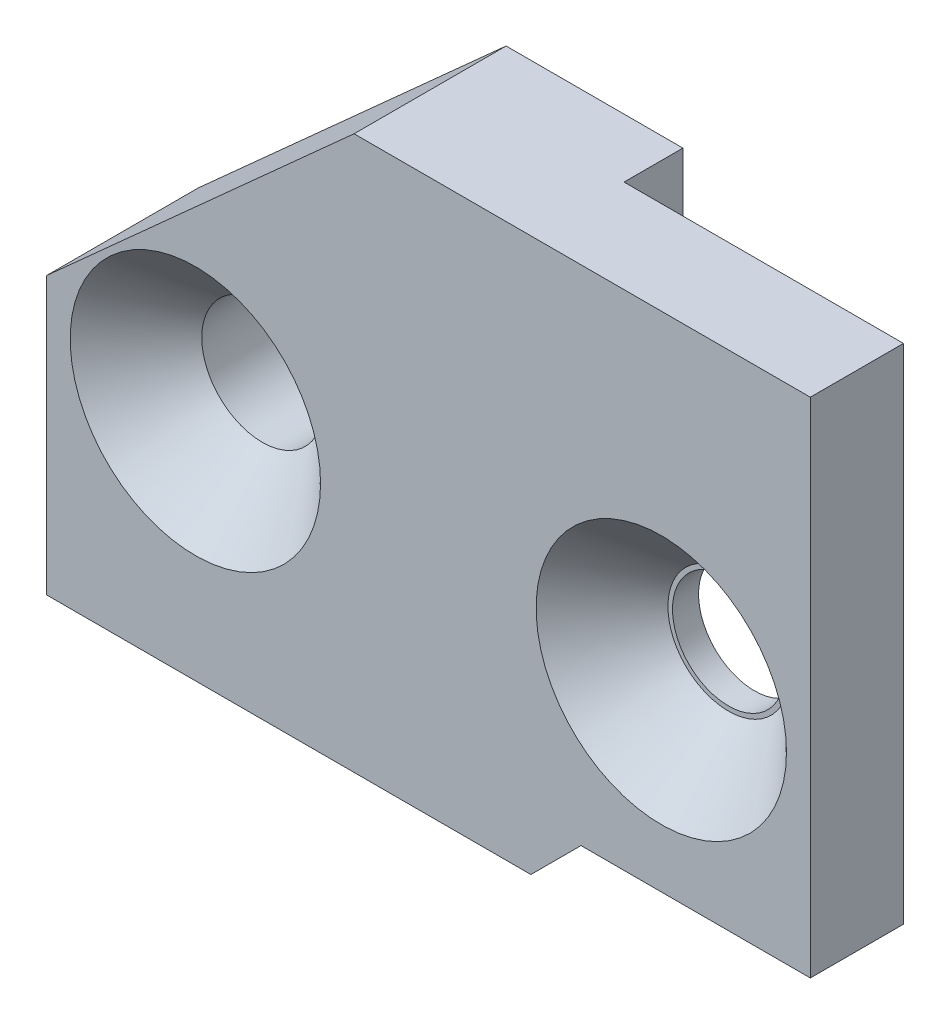
ISO-10303-21;
HEADER;
FILE_DESCRIPTION(('STEP AP214'),'2;1');
FILE_NAME('part.step','',(''),(''),'','','');
FILE_SCHEMA(('AUTOMOTIVE_DESIGN { 1 0 10303 214 1 1 1 1 }'));
ENDSEC;
DATA;
#1=APPLICATION_CONTEXT('core data for automotive mechanical design processes');
#2=APPLICATION_PROTOCOL_DEFINITION('international standard','automotive_design',2000,#1);
#3=PRODUCT_CONTEXT('',#1,'mechanical');
#4=PRODUCT('Part','Part','',(#3));
#5=PRODUCT_RELATED_PRODUCT_CATEGORY('part','',(#4));
#6=PRODUCT_DEFINITION_FORMATION('','',#4);
#7=PRODUCT_DEFINITION_CONTEXT('part definition',#1,'design');
#8=PRODUCT_DEFINITION('design','',#6,#7);
#9=PRODUCT_DEFINITION_SHAPE('','',#8);
#10=(LENGTH_UNIT() NAMED_UNIT(*) SI_UNIT(.MILLI.,.METRE.));
#11=(NAMED_UNIT(*) PLANE_ANGLE_UNIT() SI_UNIT($,.RADIAN.));
#12=(NAMED_UNIT(*) SI_UNIT($,.STERADIAN.) SOLID_ANGLE_UNIT());
#13=UNCERTAINTY_MEASURE_WITH_UNIT(LENGTH_MEASURE(1.E-05),#10,'distance_accuracy_value','');
#14=(GEOMETRIC_REPRESENTATION_CONTEXT(3) GLOBAL_UNCERTAINTY_ASSIGNED_CONTEXT((#13)) GLOBAL_UNIT_ASSIGNED_CONTEXT((#10,
#11,#12)) REPRESENTATION_CONTEXT('',''));
#15=CARTESIAN_POINT('',(0.,0.,0.));
#16=DIRECTION('',(0.,0.,1.));
#17=DIRECTION('',(1.,0.,0.));
#18=AXIS2_PLACEMENT_3D('',#15,#16,#17);
#19=CARTESIAN_POINT('',(-165.232371,-75.223646,2.5));
#20=DIRECTION('',(0.,0.,-1.));
#21=DIRECTION('',(-1.,0.,0.));
#22=AXIS2_PLACEMENT_3D('',#19,#20,#21);
#23=CYLINDRICAL_SURFACE('',#22,1.5);
#24=CARTESIAN_POINT('',(-165.232371,-75.223646,0.));
#25=DIRECTION('',(0.,0.,1.));
#26=DIRECTION('',(1.,0.,0.));
#27=AXIS2_PLACEMENT_3D('',#24,#25,#26);
#28=CIRCLE('',#27,1.5);
#29=CARTESIAN_POINT('',(-163.732371,-75.223646,0.));
#30=VERTEX_POINT('',#29);
#31=EDGE_CURVE('E153',#30,#30,#28,.T.);
#32=ORIENTED_EDGE('',*,*,#31,.F.);
#33=EDGE_LOOP('',(#32));
#34=FACE_BOUND('',#33,.T.);
#35=CARTESIAN_POINT('',(-165.232371,-75.223646,0.7));
#36=DIRECTION('',(0.,0.,1.));
#37=DIRECTION('',(1.,0.,0.));
#38=AXIS2_PLACEMENT_3D('',#35,#36,#37);
#39=CIRCLE('',#38,1.5);
#40=CARTESIAN_POINT('',(-163.732371,-75.223646,0.7));
#41=VERTEX_POINT('',#40);
#42=EDGE_CURVE('E149',#41,#41,#39,.T.);
#43=ORIENTED_EDGE('',*,*,#42,.T.);
#44=EDGE_LOOP('',(#43));
#45=FACE_BOUND('',#44,.T.);
#46=ADVANCED_FACE('F33',(#34,#45),#23,.F.);
#47=CARTESIAN_POINT('',(0.,0.,2.5));
#48=DIRECTION('',(0.,0.,-1.));
#49=DIRECTION('',(-1.,0.,0.));
#50=AXIS2_PLACEMENT_3D('',#47,#48,#49);
#51=PLANE('',#50);
#52=CARTESIAN_POINT('',(-177.73707047,-75.223646,2.5));
#53=DIRECTION('',(0.,0.,1.));
#54=DIRECTION('',(1.,0.,0.));
#55=AXIS2_PLACEMENT_3D('',#52,#53,#54);
#56=CIRCLE('',#55,3.35997123000001);
#57=CARTESIAN_POINT('',(-174.37709924,-75.223646,2.5));
#58=VERTEX_POINT('',#57);
#59=EDGE_CURVE('E147',#58,#58,#56,.T.);
#60=ORIENTED_EDGE('',*,*,#59,.F.);
#61=EDGE_LOOP('',(#60));
#62=FACE_BOUND('',#61,.T.);
#63=CARTESIAN_POINT('',(-165.232371,-75.223646,2.5));
#64=DIRECTION('',(0.,0.,1.));
#65=DIRECTION('',(1.,0.,0.));
#66=AXIS2_PLACEMENT_3D('',#63,#64,#65);
#67=CIRCLE('',#66,3.35997123000001);
#68=CARTESIAN_POINT('',(-161.87239977,-75.223646,2.5));
#69=VERTEX_POINT('',#68);
#70=EDGE_CURVE('E138',#69,#69,#67,.T.);
#71=ORIENTED_EDGE('',*,*,#70,.F.);
#72=EDGE_LOOP('',(#71));
#73=FACE_BOUND('',#72,.T.);
#74=DIRECTION('',(0.,-1.,0.));
#75=VECTOR('',#74,1.);
#76=CARTESIAN_POINT('',(-181.732371,-81.493646,2.5));
#77=LINE('',#76,#75);
#78=CARTESIAN_POINT('',(-181.732371,-74.071146,2.5));
#79=VERTEX_POINT('',#78);
#80=CARTESIAN_POINT('',(-181.732371,-81.493646,2.5));
#81=VERTEX_POINT('',#80);
#82=EDGE_CURVE('E156',#79,#81,#77,.T.);
#83=ORIENTED_EDGE('',*,*,#82,.T.);
#84=DIRECTION('',(1.,0.,0.));
#85=VECTOR('',#84,1.);
#86=CARTESIAN_POINT('',(-168.732371,-81.493646,2.5));
#87=LINE('',#86,#85);
#88=CARTESIAN_POINT('',(-168.732371,-81.493646,2.5));
#89=VERTEX_POINT('',#88);
#90=EDGE_CURVE('E159',#81,#89,#87,.T.);
#91=ORIENTED_EDGE('',*,*,#90,.T.);
#92=DIRECTION('',(0.707106781186551,0.707106781186544,0.));
#93=VECTOR('',#92,1.);
#94=CARTESIAN_POINT('',(-167.387371,-80.148646,2.5));
#95=LINE('',#94,#93);
#96=CARTESIAN_POINT('',(-167.387371,-80.148646,2.5));
#97=VERTEX_POINT('',#96);
#98=EDGE_CURVE('E161',#89,#97,#95,.T.);
#99=ORIENTED_EDGE('',*,*,#98,.T.);
#100=DIRECTION('',(1.,0.,0.));
#101=VECTOR('',#100,1.);
#102=CARTESIAN_POINT('',(-161.232371,-80.148646,2.5));
#103=LINE('',#102,#101);
#104=CARTESIAN_POINT('',(-161.232371,-80.148646,2.5));
#105=VERTEX_POINT('',#104);
#106=EDGE_CURVE('E163',#97,#105,#103,.T.);
#107=ORIENTED_EDGE('',*,*,#106,.T.);
#108=DIRECTION('',(0.,1.,0.));
#109=VECTOR('',#108,1.);
#110=CARTESIAN_POINT('',(-161.232371,-66.648646,2.5));
#111=LINE('',#110,#109);
#112=CARTESIAN_POINT('',(-161.232371,-66.648646,2.5));
#113=VERTEX_POINT('',#112);
#114=EDGE_CURVE('E165',#105,#113,#111,.T.);
#115=ORIENTED_EDGE('',*,*,#114,.T.);
#116=DIRECTION('',(-1.,0.,0.));
#117=VECTOR('',#116,1.);
#118=CARTESIAN_POINT('',(-173.47767153,-66.648646,2.5));
#119=LINE('',#118,#117);
#120=CARTESIAN_POINT('',(-173.47767153,-66.648646,2.5));
#121=VERTEX_POINT('',#120);
#122=EDGE_CURVE('E167',#113,#121,#119,.T.);
#123=ORIENTED_EDGE('',*,*,#122,.T.);
#124=DIRECTION('',(-0.74359549886798,-0.668629743627428,0.));
#125=VECTOR('',#124,1.);
#126=CARTESIAN_POINT('',(-181.732371,-74.071146,2.5));
#127=LINE('',#126,#125);
#128=EDGE_CURVE('E169',#121,#79,#127,.T.);
#129=ORIENTED_EDGE('',*,*,#128,.T.);
#130=EDGE_LOOP('',(#83,#91,#99,#107,#115,#123,#129));
#131=FACE_BOUND('',#130,.T.);
#132=ADVANCED_FACE('F229',(#62,#73,#131),#51,.F.);
#133=CARTESIAN_POINT('',(0.,0.,0.));
#134=DIRECTION('',(0.,0.,-1.));
#135=DIRECTION('',(-1.,0.,0.));
#136=AXIS2_PLACEMENT_3D('',#133,#134,#135);
#137=PLANE('',#136);
#138=DIRECTION('',(-1.,0.,0.));
#139=VECTOR('',#138,1.);
#140=CARTESIAN_POINT('',(-181.732371,-80.148646,0.));
#141=LINE('',#140,#139);
#142=CARTESIAN_POINT('',(-168.732371,-80.148646,0.));
#143=VERTEX_POINT('',#142);
#144=CARTESIAN_POINT('',(-181.732371,-80.148646,0.));
#145=VERTEX_POINT('',#144);
#146=EDGE_CURVE('E133',#143,#145,#141,.T.);
#147=ORIENTED_EDGE('',*,*,#146,.F.);
#148=DIRECTION('',(0.,-1.,0.));
#149=VECTOR('',#148,1.);
#150=CARTESIAN_POINT('',(-168.732371,-80.148646,0.));
#151=LINE('',#150,#149);
#152=CARTESIAN_POINT('',(-168.732371,-66.648646,0.));
#153=VERTEX_POINT('',#152);
#154=EDGE_CURVE('E50',#153,#143,#151,.T.);
#155=ORIENTED_EDGE('',*,*,#154,.F.);
#156=DIRECTION('',(-1.,0.,0.));
#157=VECTOR('',#156,1.);
#158=CARTESIAN_POINT('',(-173.47767153,-66.648646,0.));
#159=LINE('',#158,#157);
#160=CARTESIAN_POINT('',(-161.232371,-66.648646,0.));
#161=VERTEX_POINT('',#160);
#162=EDGE_CURVE('E137',#161,#153,#159,.T.);
#163=ORIENTED_EDGE('',*,*,#162,.F.);
#164=DIRECTION('',(0.,1.,0.));
#165=VECTOR('',#164,1.);
#166=CARTESIAN_POINT('',(-161.232371,-66.648646,0.));
#167=LINE('',#166,#165);
#168=CARTESIAN_POINT('',(-161.232371,-80.148646,0.));
#169=VERTEX_POINT('',#168);
#170=EDGE_CURVE('E179',#169,#161,#167,.T.);
#171=ORIENTED_EDGE('',*,*,#170,.F.);
#172=DIRECTION('',(1.,0.,0.));
#173=VECTOR('',#172,1.);
#174=CARTESIAN_POINT('',(-161.232371,-80.148646,0.));
#175=LINE('',#174,#173);
#176=CARTESIAN_POINT('',(-167.387371,-80.148646,0.));
#177=VERTEX_POINT('',#176);
#178=EDGE_CURVE('E177',#177,#169,#175,.T.);
#179=ORIENTED_EDGE('',*,*,#178,.F.);
#180=DIRECTION('',(0.707106781186551,0.707106781186544,0.));
#181=VECTOR('',#180,1.);
#182=CARTESIAN_POINT('',(-167.387371,-80.148646,0.));
#183=LINE('',#182,#181);
#184=CARTESIAN_POINT('',(-168.732371,-81.493646,0.));
#185=VERTEX_POINT('',#184);
#186=EDGE_CURVE('E175',#185,#177,#183,.T.);
#187=ORIENTED_EDGE('',*,*,#186,.F.);
#188=DIRECTION('',(1.,0.,0.));
#189=VECTOR('',#188,1.);
#190=CARTESIAN_POINT('',(-168.732371,-81.493646,0.));
#191=LINE('',#190,#189);
#192=CARTESIAN_POINT('',(-181.732371,-81.493646,0.));
#193=VERTEX_POINT('',#192);
#194=EDGE_CURVE('E173',#193,#185,#191,.T.);
#195=ORIENTED_EDGE('',*,*,#194,.F.);
#196=DIRECTION('',(0.,-1.,0.));
#197=VECTOR('',#196,1.);
#198=CARTESIAN_POINT('',(-181.732371,-81.493646,0.));
#199=LINE('',#198,#197);
#200=EDGE_CURVE('E56',#145,#193,#199,.T.);
#201=ORIENTED_EDGE('',*,*,#200,.F.);
#202=EDGE_LOOP('',(#147,#155,#163,#171,#179,#187,#195,#201));
#203=FACE_BOUND('',#202,.T.);
#204=ORIENTED_EDGE('',*,*,#31,.T.);
#205=EDGE_LOOP('',(#204));
#206=FACE_BOUND('',#205,.T.);
#207=ADVANCED_FACE('F226',(#203,#206),#137,.T.);
#208=CARTESIAN_POINT('',(-181.732371,-81.493646,2.5));
#209=DIRECTION('',(1.,0.,0.));
#210=DIRECTION('',(0.,0.,-1.));
#211=AXIS2_PLACEMENT_3D('',#208,#209,#210);
#212=PLANE('',#211);
#213=DIRECTION('',(0.,0.,-1.));
#214=VECTOR('',#213,1.);
#215=CARTESIAN_POINT('',(-181.732371,-74.071146,2.5));
#216=LINE('',#215,#214);
#217=CARTESIAN_POINT('',(-181.732371,-74.071146,-1.58));
#218=VERTEX_POINT('',#217);
#219=EDGE_CURVE('E171',#79,#218,#216,.T.);
#220=ORIENTED_EDGE('',*,*,#219,.T.);
#221=DIRECTION('',(0.,1.,0.));
#222=VECTOR('',#221,1.);
#223=CARTESIAN_POINT('',(-181.732371,-74.071146,-1.58));
#224=LINE('',#223,#222);
#225=CARTESIAN_POINT('',(-181.732371,-80.148646,-1.58));
#226=VERTEX_POINT('',#225);
#227=EDGE_CURVE('E216',#226,#218,#224,.T.);
#228=ORIENTED_EDGE('',*,*,#227,.F.);
#229=DIRECTION('',(0.,0.,1.));
#230=VECTOR('',#229,1.);
#231=CARTESIAN_POINT('',(-181.732371,-80.148646,-1.58));
#232=LINE('',#231,#230);
#233=EDGE_CURVE('E143',#226,#145,#232,.T.);
#234=ORIENTED_EDGE('',*,*,#233,.T.);
#235=ORIENTED_EDGE('',*,*,#200,.T.);
#236=DIRECTION('',(0.,0.,-1.));
#237=VECTOR('',#236,1.);
#238=CARTESIAN_POINT('',(-181.732371,-81.493646,2.5));
#239=LINE('',#238,#237);
#240=EDGE_CURVE('E11',#81,#193,#239,.T.);
#241=ORIENTED_EDGE('',*,*,#240,.F.);
#242=ORIENTED_EDGE('',*,*,#82,.F.);
#243=EDGE_LOOP('',(#220,#228,#234,#235,#241,#242));
#244=FACE_BOUND('',#243,.T.);
#245=ADVANCED_FACE('F35',(#244),#212,.F.);
#246=CARTESIAN_POINT('',(-168.732371,-81.493646,2.5));
#247=DIRECTION('',(0.,1.,0.));
#248=DIRECTION('',(0.,0.,1.));
#249=AXIS2_PLACEMENT_3D('',#246,#247,#248);
#250=PLANE('',#249);
#251=ORIENTED_EDGE('',*,*,#194,.T.);
#252=DIRECTION('',(0.,0.,-1.));
#253=VECTOR('',#252,1.);
#254=CARTESIAN_POINT('',(-168.732371,-81.493646,2.5));
#255=LINE('',#254,#253);
#256=EDGE_CURVE('E42',#89,#185,#255,.T.);
#257=ORIENTED_EDGE('',*,*,#256,.F.);
#258=ORIENTED_EDGE('',*,*,#90,.F.);
#259=ORIENTED_EDGE('',*,*,#240,.T.);
#260=EDGE_LOOP('',(#251,#257,#258,#259));
#261=FACE_BOUND('',#260,.T.);
#262=ADVANCED_FACE('F258',(#261),#250,.F.);
#263=CARTESIAN_POINT('',(-167.387371,-80.148646,2.5));
#264=DIRECTION('',(-0.707106781186544,0.707106781186551,0.));
#265=DIRECTION('',(-0.707106781186551,-0.707106781186544,0.));
#266=AXIS2_PLACEMENT_3D('',#263,#264,#265);
#267=PLANE('',#266);
#268=ORIENTED_EDGE('',*,*,#186,.T.);
#269=DIRECTION('',(0.,0.,-1.));
#270=VECTOR('',#269,1.);
#271=CARTESIAN_POINT('',(-167.387371,-80.148646,2.5));
#272=LINE('',#271,#270);
#273=EDGE_CURVE('E190',#97,#177,#272,.T.);
#274=ORIENTED_EDGE('',*,*,#273,.F.);
#275=ORIENTED_EDGE('',*,*,#98,.F.);
#276=ORIENTED_EDGE('',*,*,#256,.T.);
#277=EDGE_LOOP('',(#268,#274,#275,#276));
#278=FACE_BOUND('',#277,.T.);
#279=ADVANCED_FACE('F255',(#278),#267,.F.);
#280=CARTESIAN_POINT('',(-161.232371,-80.148646,2.5));
#281=DIRECTION('',(0.,1.,0.));
#282=DIRECTION('',(0.,0.,1.));
#283=AXIS2_PLACEMENT_3D('',#280,#281,#282);
#284=PLANE('',#283);
#285=ORIENTED_EDGE('',*,*,#178,.T.);
#286=DIRECTION('',(0.,0.,-1.));
#287=VECTOR('',#286,1.);
#288=CARTESIAN_POINT('',(-161.232371,-80.148646,2.5));
#289=LINE('',#288,#287);
#290=EDGE_CURVE('E187',#105,#169,#289,.T.);
#291=ORIENTED_EDGE('',*,*,#290,.F.);
#292=ORIENTED_EDGE('',*,*,#106,.F.);
#293=ORIENTED_EDGE('',*,*,#273,.T.);
#294=EDGE_LOOP('',(#285,#291,#292,#293));
#295=FACE_BOUND('',#294,.T.);
#296=ADVANCED_FACE('F251',(#295),#284,.F.);
#297=CARTESIAN_POINT('',(-161.232371,-66.648646,2.5));
#298=DIRECTION('',(-1.,0.,0.));
#299=DIRECTION('',(0.,0.,1.));
#300=AXIS2_PLACEMENT_3D('',#297,#298,#299);
#301=PLANE('',#300);
#302=ORIENTED_EDGE('',*,*,#170,.T.);
#303=DIRECTION('',(0.,0.,-1.));
#304=VECTOR('',#303,1.);
#305=CARTESIAN_POINT('',(-161.232371,-66.648646,2.5));
#306=LINE('',#305,#304);
#307=EDGE_CURVE('E185',#113,#161,#306,.T.);
#308=ORIENTED_EDGE('',*,*,#307,.F.);
#309=ORIENTED_EDGE('',*,*,#114,.F.);
#310=ORIENTED_EDGE('',*,*,#290,.T.);
#311=EDGE_LOOP('',(#302,#308,#309,#310));
#312=FACE_BOUND('',#311,.T.);
#313=ADVANCED_FACE('F248',(#312),#301,.F.);
#314=CARTESIAN_POINT('',(-173.47767153,-66.648646,2.5));
#315=DIRECTION('',(0.,-1.,0.));
#316=DIRECTION('',(0.,0.,-1.));
#317=AXIS2_PLACEMENT_3D('',#314,#315,#316);
#318=PLANE('',#317);
#319=ORIENTED_EDGE('',*,*,#162,.T.);
#320=DIRECTION('',(0.,0.,1.));
#321=VECTOR('',#320,1.);
#322=CARTESIAN_POINT('',(-168.732371,-66.648646,-1.58));
#323=LINE('',#322,#321);
#324=CARTESIAN_POINT('',(-168.732371,-66.648646,-1.58));
#325=VERTEX_POINT('',#324);
#326=EDGE_CURVE('E116',#325,#153,#323,.T.);
#327=ORIENTED_EDGE('',*,*,#326,.F.);
#328=DIRECTION('',(1.,0.,0.));
#329=VECTOR('',#328,1.);
#330=CARTESIAN_POINT('',(-168.732371,-66.648646,-1.58));
#331=LINE('',#330,#329);
#332=CARTESIAN_POINT('',(-173.47767153,-66.648646,-1.58));
#333=VERTEX_POINT('',#332);
#334=EDGE_CURVE('E122',#333,#325,#331,.T.);
#335=ORIENTED_EDGE('',*,*,#334,.F.);
#336=DIRECTION('',(0.,0.,-1.));
#337=VECTOR('',#336,1.);
#338=CARTESIAN_POINT('',(-173.47767153,-66.648646,2.5));
#339=LINE('',#338,#337);
#340=EDGE_CURVE('E183',#121,#333,#339,.T.);
#341=ORIENTED_EDGE('',*,*,#340,.F.);
#342=ORIENTED_EDGE('',*,*,#122,.F.);
#343=ORIENTED_EDGE('',*,*,#307,.T.);
#344=EDGE_LOOP('',(#319,#327,#335,#341,#342,#343));
#345=FACE_BOUND('',#344,.T.);
#346=ADVANCED_FACE('F135',(#345),#318,.F.);
#347=CARTESIAN_POINT('',(-181.732371,-74.071146,2.5));
#348=DIRECTION('',(0.668629743627428,-0.74359549886798,0.));
#349=DIRECTION('',(0.74359549886798,0.668629743627428,0.));
#350=AXIS2_PLACEMENT_3D('',#347,#348,#349);
#351=PLANE('',#350);
#352=ORIENTED_EDGE('',*,*,#340,.T.);
#353=DIRECTION('',(0.74359549886798,0.668629743627428,0.));
#354=VECTOR('',#353,1.);
#355=CARTESIAN_POINT('',(-173.47767153,-66.648646,-1.58));
#356=LINE('',#355,#354);
#357=EDGE_CURVE('E130',#218,#333,#356,.T.);
#358=ORIENTED_EDGE('',*,*,#357,.F.);
#359=ORIENTED_EDGE('',*,*,#219,.F.);
#360=ORIENTED_EDGE('',*,*,#128,.F.);
#361=EDGE_LOOP('',(#352,#358,#359,#360));
#362=FACE_BOUND('',#361,.T.);
#363=ADVANCED_FACE('F207',(#362),#351,.F.);
#364=CARTESIAN_POINT('',(-177.73707047,-75.223646,2.5));
#365=DIRECTION('',(0.,0.,-1.));
#366=DIRECTION('',(-1.,0.,0.));
#367=AXIS2_PLACEMENT_3D('',#364,#365,#366);
#368=CYLINDRICAL_SURFACE('',#367,1.625);
#369=CARTESIAN_POINT('',(-177.73707047,-75.223646,0.703384697780489));
#370=DIRECTION('',(0.,0.,1.));
#371=DIRECTION('',(1.,0.,0.));
#372=AXIS2_PLACEMENT_3D('',#369,#370,#371);
#373=CIRCLE('',#372,1.625);
#374=CARTESIAN_POINT('',(-176.11207047,-75.223646,0.703384697780489));
#375=VERTEX_POINT('',#374);
#376=EDGE_CURVE('E37',#375,#375,#373,.F.);
#377=ORIENTED_EDGE('',*,*,#376,.F.);
#378=EDGE_LOOP('',(#377));
#379=FACE_BOUND('',#378,.T.);
#380=CARTESIAN_POINT('',(-177.73707047,-75.223646,-1.58));
#381=DIRECTION('',(0.,0.,-1.));
#382=DIRECTION('',(-1.,0.,0.));
#383=AXIS2_PLACEMENT_3D('',#380,#381,#382);
#384=CIRCLE('',#383,1.625);
#385=CARTESIAN_POINT('',(-179.36207047,-75.223646,-1.58));
#386=VERTEX_POINT('',#385);
#387=EDGE_CURVE('E211',#386,#386,#384,.T.);
#388=ORIENTED_EDGE('',*,*,#387,.T.);
#389=EDGE_LOOP('',(#388));
#390=FACE_BOUND('',#389,.T.);
#391=ADVANCED_FACE('F203',(#379,#390),#368,.F.);
#392=CARTESIAN_POINT('',(-165.232371,-75.223646,2.5));
#393=DIRECTION('',(0.,0.,1.));
#394=DIRECTION('',(1.,0.,0.));
#395=AXIS2_PLACEMENT_3D('',#392,#393,#394);
#396=CONICAL_SURFACE('',#395,3.35997123000001,0.767944870877507);
#397=CARTESIAN_POINT('',(-165.232371,-75.223646,0.7));
#398=DIRECTION('',(0.,0.,1.));
#399=DIRECTION('',(1.,0.,0.));
#400=AXIS2_PLACEMENT_3D('',#397,#398,#399);
#401=CIRCLE('',#400,1.62173143534727);
#402=CARTESIAN_POINT('',(-163.610639564653,-75.223646,0.7));
#403=VERTEX_POINT('',#402);
#404=EDGE_CURVE('E141',#403,#403,#401,.T.);
#405=ORIENTED_EDGE('',*,*,#404,.F.);
#406=EDGE_LOOP('',(#405));
#407=FACE_BOUND('',#406,.T.);
#408=ORIENTED_EDGE('',*,*,#70,.T.);
#409=EDGE_LOOP('',(#408));
#410=FACE_BOUND('',#409,.T.);
#411=ADVANCED_FACE('F206',(#407,#410),#396,.F.);
#412=CARTESIAN_POINT('',(-165.232371,-75.223646,0.7));
#413=DIRECTION('',(0.,0.,1.));
#414=DIRECTION('',(1.,0.,0.));
#415=AXIS2_PLACEMENT_3D('',#412,#413,#414);
#416=PLANE('',#415);
#417=ORIENTED_EDGE('',*,*,#42,.F.);
#418=EDGE_LOOP('',(#417));
#419=FACE_BOUND('',#418,.T.);
#420=ORIENTED_EDGE('',*,*,#404,.T.);
#421=EDGE_LOOP('',(#420));
#422=FACE_BOUND('',#421,.T.);
#423=ADVANCED_FACE('F304',(#419,#422),#416,.T.);
#424=CARTESIAN_POINT('',(-177.73707047,-75.223646,2.5));
#425=DIRECTION('',(0.,0.,1.));
#426=DIRECTION('',(1.,0.,0.));
#427=AXIS2_PLACEMENT_3D('',#424,#425,#426);
#428=CONICAL_SURFACE('',#427,3.35997123000001,0.767944870877507);
#429=ORIENTED_EDGE('',*,*,#376,.T.);
#430=EDGE_LOOP('',(#429));
#431=FACE_BOUND('',#430,.T.);
#432=ORIENTED_EDGE('',*,*,#59,.T.);
#433=EDGE_LOOP('',(#432));
#434=FACE_BOUND('',#433,.T.);
#435=ADVANCED_FACE('F200',(#431,#434),#428,.F.);
#436=CARTESIAN_POINT('',(0.,0.,-1.58));
#437=DIRECTION('',(0.,0.,1.));
#438=DIRECTION('',(1.,0.,0.));
#439=AXIS2_PLACEMENT_3D('',#436,#437,#438);
#440=PLANE('',#439);
#441=ORIENTED_EDGE('',*,*,#334,.T.);
#442=DIRECTION('',(0.,-1.,0.));
#443=VECTOR('',#442,1.);
#444=CARTESIAN_POINT('',(-168.732371,-80.148646,-1.58));
#445=LINE('',#444,#443);
#446=CARTESIAN_POINT('',(-168.732371,-80.148646,-1.58));
#447=VERTEX_POINT('',#446);
#448=EDGE_CURVE('E112',#325,#447,#445,.T.);
#449=ORIENTED_EDGE('',*,*,#448,.T.);
#450=DIRECTION('',(-1.,0.,0.));
#451=VECTOR('',#450,1.);
#452=CARTESIAN_POINT('',(-181.732371,-80.148646,-1.58));
#453=LINE('',#452,#451);
#454=EDGE_CURVE('E121',#447,#226,#453,.T.);
#455=ORIENTED_EDGE('',*,*,#454,.T.);
#456=ORIENTED_EDGE('',*,*,#227,.T.);
#457=ORIENTED_EDGE('',*,*,#357,.T.);
#458=EDGE_LOOP('',(#441,#449,#455,#456,#457));
#459=FACE_BOUND('',#458,.T.);
#460=ORIENTED_EDGE('',*,*,#387,.F.);
#461=EDGE_LOOP('',(#460));
#462=FACE_BOUND('',#461,.T.);
#463=ADVANCED_FACE('F126',(#459,#462),#440,.F.);
#464=CARTESIAN_POINT('',(-168.732371,-80.148646,-1.58));
#465=DIRECTION('',(-1.,0.,0.));
#466=DIRECTION('',(0.,0.,1.));
#467=AXIS2_PLACEMENT_3D('',#464,#465,#466);
#468=PLANE('',#467);
#469=ORIENTED_EDGE('',*,*,#154,.T.);
#470=DIRECTION('',(0.,0.,1.));
#471=VECTOR('',#470,1.);
#472=CARTESIAN_POINT('',(-168.732371,-80.148646,-1.58));
#473=LINE('',#472,#471);
#474=EDGE_CURVE('E118',#447,#143,#473,.T.);
#475=ORIENTED_EDGE('',*,*,#474,.F.);
#476=ORIENTED_EDGE('',*,*,#448,.F.);
#477=ORIENTED_EDGE('',*,*,#326,.T.);
#478=EDGE_LOOP('',(#469,#475,#476,#477));
#479=FACE_BOUND('',#478,.T.);
#480=ADVANCED_FACE('F114',(#479),#468,.F.);
#481=CARTESIAN_POINT('',(-181.732371,-80.148646,-1.58));
#482=DIRECTION('',(0.,1.,0.));
#483=DIRECTION('',(0.,0.,1.));
#484=AXIS2_PLACEMENT_3D('',#481,#482,#483);
#485=PLANE('',#484);
#486=ORIENTED_EDGE('',*,*,#146,.T.);
#487=ORIENTED_EDGE('',*,*,#233,.F.);
#488=ORIENTED_EDGE('',*,*,#454,.F.);
#489=ORIENTED_EDGE('',*,*,#474,.T.);
#490=EDGE_LOOP('',(#486,#487,#488,#489));
#491=FACE_BOUND('',#490,.T.);
#492=ADVANCED_FACE('F225',(#491),#485,.F.);
#493=CLOSED_SHELL('',(#46,#132,#207,#245,#262,#279,#296,#313,#346,#363,#391,#411,#423,#435,#463,
#480,#492));
#494=MANIFOLD_SOLID_BREP('B2',#493);
#495=ADVANCED_BREP_SHAPE_REPRESENTATION('',(#18,#494),#14);
#496=SHAPE_DEFINITION_REPRESENTATION(#9,#495);
ENDSEC;
END-ISO-10303-21;
